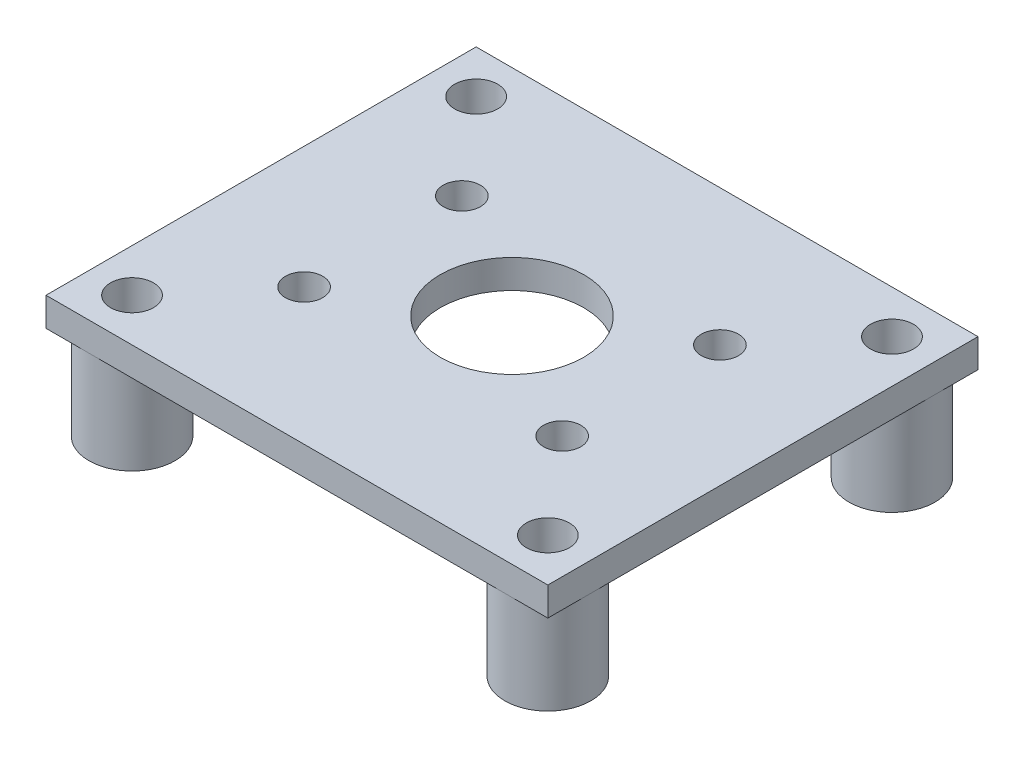
ISO-10303-21;
HEADER;
FILE_DESCRIPTION(('STEP AP214'),'2;1');
FILE_NAME('part.step','',(''),(''),'','','');
FILE_SCHEMA(('AUTOMOTIVE_DESIGN { 1 0 10303 214 1 1 1 1 }'));
ENDSEC;
DATA;
#1=APPLICATION_CONTEXT('core data for automotive mechanical design processes');
#2=APPLICATION_PROTOCOL_DEFINITION('international standard','automotive_design',2000,#1);
#3=PRODUCT_CONTEXT('',#1,'mechanical');
#4=PRODUCT('Part','Part','',(#3));
#5=PRODUCT_RELATED_PRODUCT_CATEGORY('part','',(#4));
#6=PRODUCT_DEFINITION_FORMATION('','',#4);
#7=PRODUCT_DEFINITION_CONTEXT('part definition',#1,'design');
#8=PRODUCT_DEFINITION('design','',#6,#7);
#9=PRODUCT_DEFINITION_SHAPE('','',#8);
#10=(LENGTH_UNIT() NAMED_UNIT(*) SI_UNIT(.MILLI.,.METRE.));
#11=(NAMED_UNIT(*) PLANE_ANGLE_UNIT() SI_UNIT($,.RADIAN.));
#12=(NAMED_UNIT(*) SI_UNIT($,.STERADIAN.) SOLID_ANGLE_UNIT());
#13=UNCERTAINTY_MEASURE_WITH_UNIT(LENGTH_MEASURE(1.E-05),#10,'distance_accuracy_value','');
#14=(GEOMETRIC_REPRESENTATION_CONTEXT(3) GLOBAL_UNCERTAINTY_ASSIGNED_CONTEXT((#13)) GLOBAL_UNIT_ASSIGNED_CONTEXT((#10,
#11,#12)) REPRESENTATION_CONTEXT('',''));
#15=CARTESIAN_POINT('',(0.,0.,0.));
#16=DIRECTION('',(0.,0.,1.));
#17=DIRECTION('',(1.,0.,0.));
#18=AXIS2_PLACEMENT_3D('',#15,#16,#17);
#19=CARTESIAN_POINT('',(0.,0.,0.));
#20=DIRECTION('',(0.,1.,0.));
#21=DIRECTION('',(0.,0.,1.));
#22=AXIS2_PLACEMENT_3D('',#19,#20,#21);
#23=PLANE('',#22);
#24=CARTESIAN_POINT('',(14.5,0.,-12.));
#25=DIRECTION('',(0.,-1.,0.));
#26=DIRECTION('',(0.,0.,-1.));
#27=AXIS2_PLACEMENT_3D('',#24,#25,#26);
#28=CIRCLE('',#27,3.);
#29=CARTESIAN_POINT('',(14.5,0.,-15.));
#30=VERTEX_POINT('',#29);
#31=CARTESIAN_POINT('',(17.5,0.,-12.));
#32=VERTEX_POINT('',#31);
#33=EDGE_CURVE('E118',#30,#32,#28,.T.);
#34=ORIENTED_EDGE('',*,*,#33,.F.);
#35=DIRECTION('',(-1.,0.,0.));
#36=VECTOR('',#35,1.);
#37=CARTESIAN_POINT('',(-17.5,0.,-15.));
#38=LINE('',#37,#36);
#39=CARTESIAN_POINT('',(17.5,0.,-15.));
#40=VERTEX_POINT('',#39);
#41=EDGE_CURVE('E103',#40,#30,#38,.T.);
#42=ORIENTED_EDGE('',*,*,#41,.F.);
#43=DIRECTION('',(0.,0.,-1.));
#44=VECTOR('',#43,1.);
#45=CARTESIAN_POINT('',(17.5,0.,-15.));
#46=LINE('',#45,#44);
#47=EDGE_CURVE('E119',#32,#40,#46,.T.);
#48=ORIENTED_EDGE('',*,*,#47,.F.);
#49=EDGE_LOOP('',(#34,#42,#48));
#50=FACE_BOUND('',#49,.T.);
#51=ADVANCED_FACE('F36',(#50),#23,.F.);
#52=CARTESIAN_POINT('',(-14.5,0.,-12.));
#53=DIRECTION('',(0.,-1.,0.));
#54=DIRECTION('',(0.,0.,-1.));
#55=AXIS2_PLACEMENT_3D('',#52,#53,#54);
#56=CIRCLE('',#55,3.);
#57=CARTESIAN_POINT('',(-17.5,0.,-12.));
#58=VERTEX_POINT('',#57);
#59=CARTESIAN_POINT('',(-14.5,0.,-15.));
#60=VERTEX_POINT('',#59);
#61=EDGE_CURVE('E136',#58,#60,#56,.T.);
#62=ORIENTED_EDGE('',*,*,#61,.F.);
#63=DIRECTION('',(0.,0.,1.));
#64=VECTOR('',#63,1.);
#65=CARTESIAN_POINT('',(-17.5,0.,-15.));
#66=LINE('',#65,#64);
#67=CARTESIAN_POINT('',(-17.5,0.,-15.));
#68=VERTEX_POINT('',#67);
#69=EDGE_CURVE('E198',#68,#58,#66,.T.);
#70=ORIENTED_EDGE('',*,*,#69,.F.);
#71=EDGE_CURVE('E110',#60,#68,#38,.T.);
#72=ORIENTED_EDGE('',*,*,#71,.F.);
#73=EDGE_LOOP('',(#62,#70,#72));
#74=FACE_BOUND('',#73,.T.);
#75=ADVANCED_FACE('F218',(#74),#23,.F.);
#76=CARTESIAN_POINT('',(0.,0.,0.));
#77=DIRECTION('',(0.,1.,0.));
#78=DIRECTION('',(0.,0.,1.));
#79=AXIS2_PLACEMENT_3D('',#76,#77,#78);
#80=CIRCLE('',#79,5.);
#81=CARTESIAN_POINT('',(0.,0.,5.));
#82=VERTEX_POINT('',#81);
#83=EDGE_CURVE('E517',#82,#82,#80,.T.);
#84=ORIENTED_EDGE('',*,*,#83,.T.);
#85=EDGE_LOOP('',(#84));
#86=FACE_BOUND('',#85,.T.);
#87=EDGE_CURVE('E53',#32,#30,#28,.T.);
#88=ORIENTED_EDGE('',*,*,#87,.F.);
#89=CARTESIAN_POINT('',(17.5,0.,12.));
#90=VERTEX_POINT('',#89);
#91=EDGE_CURVE('E196',#90,#32,#46,.T.);
#92=ORIENTED_EDGE('',*,*,#91,.F.);
#93=CARTESIAN_POINT('',(14.5,0.,12.));
#94=DIRECTION('',(0.,-1.,0.));
#95=DIRECTION('',(0.,0.,-1.));
#96=AXIS2_PLACEMENT_3D('',#93,#94,#95);
#97=CIRCLE('',#96,3.);
#98=CARTESIAN_POINT('',(14.5,0.,15.));
#99=VERTEX_POINT('',#98);
#100=EDGE_CURVE('E134',#99,#90,#97,.T.);
#101=ORIENTED_EDGE('',*,*,#100,.F.);
#102=DIRECTION('',(1.,0.,0.));
#103=VECTOR('',#102,1.);
#104=CARTESIAN_POINT('',(-17.5,0.,15.));
#105=LINE('',#104,#103);
#106=CARTESIAN_POINT('',(-14.5,0.,15.));
#107=VERTEX_POINT('',#106);
#108=EDGE_CURVE('E203',#107,#99,#105,.T.);
#109=ORIENTED_EDGE('',*,*,#108,.F.);
#110=CARTESIAN_POINT('',(-14.5,0.,12.));
#111=DIRECTION('',(0.,-1.,0.));
#112=DIRECTION('',(0.,0.,-1.));
#113=AXIS2_PLACEMENT_3D('',#110,#111,#112);
#114=CIRCLE('',#113,3.);
#115=CARTESIAN_POINT('',(-17.5,0.,12.));
#116=VERTEX_POINT('',#115);
#117=EDGE_CURVE('E11',#116,#107,#114,.T.);
#118=ORIENTED_EDGE('',*,*,#117,.F.);
#119=EDGE_CURVE('E201',#58,#116,#66,.T.);
#120=ORIENTED_EDGE('',*,*,#119,.F.);
#121=EDGE_CURVE('E115',#60,#58,#56,.T.);
#122=ORIENTED_EDGE('',*,*,#121,.F.);
#123=EDGE_CURVE('E60',#30,#60,#38,.T.);
#124=ORIENTED_EDGE('',*,*,#123,.F.);
#125=EDGE_LOOP('',(#88,#92,#101,#109,#118,#120,#122,#124));
#126=FACE_BOUND('',#125,.T.);
#127=CARTESIAN_POINT('',(-9.,0.,-5.5));
#128=DIRECTION('',(0.,1.,0.));
#129=DIRECTION('',(0.,0.,1.));
#130=AXIS2_PLACEMENT_3D('',#127,#128,#129);
#131=CIRCLE('',#130,1.3);
#132=CARTESIAN_POINT('',(-9.,0.,-4.2));
#133=VERTEX_POINT('',#132);
#134=EDGE_CURVE('E169',#133,#133,#131,.F.);
#135=ORIENTED_EDGE('',*,*,#134,.F.);
#136=EDGE_LOOP('',(#135));
#137=FACE_BOUND('',#136,.T.);
#138=CARTESIAN_POINT('',(9.,0.,5.5));
#139=DIRECTION('',(0.,1.,0.));
#140=DIRECTION('',(0.,0.,1.));
#141=AXIS2_PLACEMENT_3D('',#138,#139,#140);
#142=CIRCLE('',#141,1.3);
#143=CARTESIAN_POINT('',(9.,0.,6.8));
#144=VERTEX_POINT('',#143);
#145=EDGE_CURVE('E170',#144,#144,#142,.F.);
#146=ORIENTED_EDGE('',*,*,#145,.F.);
#147=EDGE_LOOP('',(#146));
#148=FACE_BOUND('',#147,.T.);
#149=CARTESIAN_POINT('',(-9.,0.,5.5));
#150=DIRECTION('',(0.,1.,0.));
#151=DIRECTION('',(0.,0.,1.));
#152=AXIS2_PLACEMENT_3D('',#149,#150,#151);
#153=CIRCLE('',#152,1.3);
#154=CARTESIAN_POINT('',(-9.,0.,6.8));
#155=VERTEX_POINT('',#154);
#156=EDGE_CURVE('E162',#155,#155,#153,.F.);
#157=ORIENTED_EDGE('',*,*,#156,.F.);
#158=EDGE_LOOP('',(#157));
#159=FACE_BOUND('',#158,.T.);
#160=CARTESIAN_POINT('',(9.,0.,-5.5));
#161=DIRECTION('',(0.,1.,0.));
#162=DIRECTION('',(0.,0.,1.));
#163=AXIS2_PLACEMENT_3D('',#160,#161,#162);
#164=CIRCLE('',#163,1.3);
#165=CARTESIAN_POINT('',(9.,0.,-4.2));
#166=VERTEX_POINT('',#165);
#167=EDGE_CURVE('E180',#166,#166,#164,.F.);
#168=ORIENTED_EDGE('',*,*,#167,.F.);
#169=EDGE_LOOP('',(#168));
#170=FACE_BOUND('',#169,.T.);
#171=ADVANCED_FACE('F111',(#86,#126,#137,#148,#159,#170),#23,.F.);
#172=EDGE_CURVE('E46',#107,#116,#114,.T.);
#173=ORIENTED_EDGE('',*,*,#172,.F.);
#174=CARTESIAN_POINT('',(-17.5,0.,15.));
#175=VERTEX_POINT('',#174);
#176=EDGE_CURVE('E187',#175,#107,#105,.T.);
#177=ORIENTED_EDGE('',*,*,#176,.F.);
#178=EDGE_CURVE('E108',#116,#175,#66,.T.);
#179=ORIENTED_EDGE('',*,*,#178,.F.);
#180=EDGE_LOOP('',(#173,#177,#179));
#181=FACE_BOUND('',#180,.T.);
#182=ADVANCED_FACE('F249',(#181),#23,.F.);
#183=CARTESIAN_POINT('',(17.5,2.,-15.));
#184=DIRECTION('',(-1.,0.,0.));
#185=DIRECTION('',(0.,0.,1.));
#186=AXIS2_PLACEMENT_3D('',#183,#184,#185);
#187=PLANE('',#186);
#188=CARTESIAN_POINT('',(17.5,0.,15.));
#189=VERTEX_POINT('',#188);
#190=EDGE_CURVE('E194',#189,#90,#46,.T.);
#191=ORIENTED_EDGE('',*,*,#190,.T.);
#192=ORIENTED_EDGE('',*,*,#91,.T.);
#193=ORIENTED_EDGE('',*,*,#47,.T.);
#194=DIRECTION('',(0.,-1.,0.));
#195=VECTOR('',#194,1.);
#196=CARTESIAN_POINT('',(17.5,2.,-15.));
#197=LINE('',#196,#195);
#198=CARTESIAN_POINT('',(17.5,2.,-15.));
#199=VERTEX_POINT('',#198);
#200=EDGE_CURVE('E40',#199,#40,#197,.T.);
#201=ORIENTED_EDGE('',*,*,#200,.F.);
#202=DIRECTION('',(0.,0.,-1.));
#203=VECTOR('',#202,1.);
#204=CARTESIAN_POINT('',(17.5,2.,-15.));
#205=LINE('',#204,#203);
#206=CARTESIAN_POINT('',(17.5,2.,15.));
#207=VERTEX_POINT('',#206);
#208=EDGE_CURVE('E183',#207,#199,#205,.T.);
#209=ORIENTED_EDGE('',*,*,#208,.F.);
#210=DIRECTION('',(0.,-1.,0.));
#211=VECTOR('',#210,1.);
#212=CARTESIAN_POINT('',(17.5,2.,15.));
#213=LINE('',#212,#211);
#214=EDGE_CURVE('E193',#207,#189,#213,.T.);
#215=ORIENTED_EDGE('',*,*,#214,.T.);
#216=EDGE_LOOP('',(#191,#192,#193,#201,#209,#215));
#217=FACE_BOUND('',#216,.T.);
#218=ADVANCED_FACE('F38',(#217),#187,.F.);
#219=CARTESIAN_POINT('',(-17.5,2.,-15.));
#220=DIRECTION('',(0.,0.,1.));
#221=DIRECTION('',(1.,0.,0.));
#222=AXIS2_PLACEMENT_3D('',#219,#220,#221);
#223=PLANE('',#222);
#224=ORIENTED_EDGE('',*,*,#41,.T.);
#225=ORIENTED_EDGE('',*,*,#123,.T.);
#226=ORIENTED_EDGE('',*,*,#71,.T.);
#227=DIRECTION('',(0.,-1.,0.));
#228=VECTOR('',#227,1.);
#229=CARTESIAN_POINT('',(-17.5,2.,-15.));
#230=LINE('',#229,#228);
#231=CARTESIAN_POINT('',(-17.5,2.,-15.));
#232=VERTEX_POINT('',#231);
#233=EDGE_CURVE('E208',#232,#68,#230,.T.);
#234=ORIENTED_EDGE('',*,*,#233,.F.);
#235=DIRECTION('',(-1.,0.,0.));
#236=VECTOR('',#235,1.);
#237=CARTESIAN_POINT('',(-17.5,2.,-15.));
#238=LINE('',#237,#236);
#239=EDGE_CURVE('E186',#199,#232,#238,.T.);
#240=ORIENTED_EDGE('',*,*,#239,.F.);
#241=ORIENTED_EDGE('',*,*,#200,.T.);
#242=EDGE_LOOP('',(#224,#225,#226,#234,#240,#241));
#243=FACE_BOUND('',#242,.T.);
#244=ADVANCED_FACE('F104',(#243),#223,.F.);
#245=CARTESIAN_POINT('',(-17.5,2.,-15.));
#246=DIRECTION('',(1.,0.,0.));
#247=DIRECTION('',(0.,0.,-1.));
#248=AXIS2_PLACEMENT_3D('',#245,#246,#247);
#249=PLANE('',#248);
#250=ORIENTED_EDGE('',*,*,#69,.T.);
#251=ORIENTED_EDGE('',*,*,#119,.T.);
#252=ORIENTED_EDGE('',*,*,#178,.T.);
#253=DIRECTION('',(0.,-1.,0.));
#254=VECTOR('',#253,1.);
#255=CARTESIAN_POINT('',(-17.5,2.,15.));
#256=LINE('',#255,#254);
#257=CARTESIAN_POINT('',(-17.5,2.,15.));
#258=VERTEX_POINT('',#257);
#259=EDGE_CURVE('E206',#258,#175,#256,.T.);
#260=ORIENTED_EDGE('',*,*,#259,.F.);
#261=DIRECTION('',(0.,0.,1.));
#262=VECTOR('',#261,1.);
#263=CARTESIAN_POINT('',(-17.5,2.,-15.));
#264=LINE('',#263,#262);
#265=EDGE_CURVE('E189',#232,#258,#264,.T.);
#266=ORIENTED_EDGE('',*,*,#265,.F.);
#267=ORIENTED_EDGE('',*,*,#233,.T.);
#268=EDGE_LOOP('',(#250,#251,#252,#260,#266,#267));
#269=FACE_BOUND('',#268,.T.);
#270=ADVANCED_FACE('F214',(#269),#249,.F.);
#271=CARTESIAN_POINT('',(-17.5,2.,15.));
#272=DIRECTION('',(0.,0.,-1.));
#273=DIRECTION('',(-1.,0.,0.));
#274=AXIS2_PLACEMENT_3D('',#271,#272,#273);
#275=PLANE('',#274);
#276=ORIENTED_EDGE('',*,*,#176,.T.);
#277=ORIENTED_EDGE('',*,*,#108,.T.);
#278=EDGE_CURVE('E200',#99,#189,#105,.T.);
#279=ORIENTED_EDGE('',*,*,#278,.T.);
#280=ORIENTED_EDGE('',*,*,#214,.F.);
#281=DIRECTION('',(1.,0.,0.));
#282=VECTOR('',#281,1.);
#283=CARTESIAN_POINT('',(-17.5,2.,15.));
#284=LINE('',#283,#282);
#285=EDGE_CURVE('E191',#258,#207,#284,.T.);
#286=ORIENTED_EDGE('',*,*,#285,.F.);
#287=ORIENTED_EDGE('',*,*,#259,.T.);
#288=EDGE_LOOP('',(#276,#277,#279,#280,#286,#287));
#289=FACE_BOUND('',#288,.T.);
#290=ADVANCED_FACE('F257',(#289),#275,.F.);
#291=CARTESIAN_POINT('',(0.,2.,0.));
#292=DIRECTION('',(0.,1.,0.));
#293=DIRECTION('',(0.,0.,1.));
#294=AXIS2_PLACEMENT_3D('',#291,#292,#293);
#295=PLANE('',#294);
#296=CARTESIAN_POINT('',(0.,2.,0.));
#297=DIRECTION('',(0.,1.,0.));
#298=DIRECTION('',(0.,0.,1.));
#299=AXIS2_PLACEMENT_3D('',#296,#297,#298);
#300=CIRCLE('',#299,5.);
#301=CARTESIAN_POINT('',(0.,2.,5.));
#302=VERTEX_POINT('',#301);
#303=EDGE_CURVE('E514',#302,#302,#300,.T.);
#304=ORIENTED_EDGE('',*,*,#303,.F.);
#305=EDGE_LOOP('',(#304));
#306=FACE_BOUND('',#305,.T.);
#307=CARTESIAN_POINT('',(-14.5,2.,-12.));
#308=DIRECTION('',(0.,1.,0.));
#309=DIRECTION('',(0.,0.,1.));
#310=AXIS2_PLACEMENT_3D('',#307,#308,#309);
#311=CIRCLE('',#310,1.5);
#312=CARTESIAN_POINT('',(-14.5,2.,-10.5));
#313=VERTEX_POINT('',#312);
#314=EDGE_CURVE('E145',#313,#313,#311,.F.);
#315=ORIENTED_EDGE('',*,*,#314,.T.);
#316=EDGE_LOOP('',(#315));
#317=FACE_BOUND('',#316,.T.);
#318=CARTESIAN_POINT('',(14.5,2.,-12.));
#319=DIRECTION('',(0.,1.,0.));
#320=DIRECTION('',(0.,0.,1.));
#321=AXIS2_PLACEMENT_3D('',#318,#319,#320);
#322=CIRCLE('',#321,1.5);
#323=CARTESIAN_POINT('',(14.5,2.,-10.5));
#324=VERTEX_POINT('',#323);
#325=EDGE_CURVE('E152',#324,#324,#322,.F.);
#326=ORIENTED_EDGE('',*,*,#325,.T.);
#327=EDGE_LOOP('',(#326));
#328=FACE_BOUND('',#327,.T.);
#329=CARTESIAN_POINT('',(14.5,2.,12.));
#330=DIRECTION('',(0.,1.,0.));
#331=DIRECTION('',(0.,0.,1.));
#332=AXIS2_PLACEMENT_3D('',#329,#330,#331);
#333=CIRCLE('',#332,1.5);
#334=CARTESIAN_POINT('',(14.5,2.,13.5));
#335=VERTEX_POINT('',#334);
#336=EDGE_CURVE('E148',#335,#335,#333,.F.);
#337=ORIENTED_EDGE('',*,*,#336,.T.);
#338=EDGE_LOOP('',(#337));
#339=FACE_BOUND('',#338,.T.);
#340=CARTESIAN_POINT('',(-14.5,2.,12.));
#341=DIRECTION('',(0.,1.,0.));
#342=DIRECTION('',(0.,0.,1.));
#343=AXIS2_PLACEMENT_3D('',#340,#341,#342);
#344=CIRCLE('',#343,1.5);
#345=CARTESIAN_POINT('',(-14.5,2.,13.5));
#346=VERTEX_POINT('',#345);
#347=EDGE_CURVE('E151',#346,#346,#344,.F.);
#348=ORIENTED_EDGE('',*,*,#347,.T.);
#349=EDGE_LOOP('',(#348));
#350=FACE_BOUND('',#349,.T.);
#351=CARTESIAN_POINT('',(-9.,2.,-5.5));
#352=DIRECTION('',(0.,1.,0.));
#353=DIRECTION('',(0.,0.,-1.));
#354=AXIS2_PLACEMENT_3D('',#351,#352,#353);
#355=CIRCLE('',#354,1.3);
#356=CARTESIAN_POINT('',(-9.,2.,-6.8));
#357=VERTEX_POINT('',#356);
#358=EDGE_CURVE('E166',#357,#357,#355,.T.);
#359=ORIENTED_EDGE('',*,*,#358,.F.);
#360=EDGE_LOOP('',(#359));
#361=FACE_BOUND('',#360,.T.);
#362=CARTESIAN_POINT('',(9.,2.,5.5));
#363=DIRECTION('',(0.,1.,0.));
#364=DIRECTION('',(0.,0.,-1.));
#365=AXIS2_PLACEMENT_3D('',#362,#363,#364);
#366=CIRCLE('',#365,1.3);
#367=CARTESIAN_POINT('',(9.,2.,4.2));
#368=VERTEX_POINT('',#367);
#369=EDGE_CURVE('E165',#368,#368,#366,.T.);
#370=ORIENTED_EDGE('',*,*,#369,.F.);
#371=EDGE_LOOP('',(#370));
#372=FACE_BOUND('',#371,.T.);
#373=CARTESIAN_POINT('',(-9.,2.,5.5));
#374=DIRECTION('',(0.,1.,0.));
#375=DIRECTION('',(0.,0.,1.));
#376=AXIS2_PLACEMENT_3D('',#373,#374,#375);
#377=CIRCLE('',#376,1.3);
#378=CARTESIAN_POINT('',(-9.,2.,6.8));
#379=VERTEX_POINT('',#378);
#380=EDGE_CURVE('E159',#379,#379,#377,.T.);
#381=ORIENTED_EDGE('',*,*,#380,.F.);
#382=EDGE_LOOP('',(#381));
#383=FACE_BOUND('',#382,.T.);
#384=CARTESIAN_POINT('',(9.,2.,-5.5));
#385=DIRECTION('',(0.,1.,0.));
#386=DIRECTION('',(0.,0.,1.));
#387=AXIS2_PLACEMENT_3D('',#384,#385,#386);
#388=CIRCLE('',#387,1.3);
#389=CARTESIAN_POINT('',(9.,2.,-4.2));
#390=VERTEX_POINT('',#389);
#391=EDGE_CURVE('E173',#390,#390,#388,.T.);
#392=ORIENTED_EDGE('',*,*,#391,.F.);
#393=EDGE_LOOP('',(#392));
#394=FACE_BOUND('',#393,.T.);
#395=ORIENTED_EDGE('',*,*,#208,.T.);
#396=ORIENTED_EDGE('',*,*,#239,.T.);
#397=ORIENTED_EDGE('',*,*,#265,.T.);
#398=ORIENTED_EDGE('',*,*,#285,.T.);
#399=EDGE_LOOP('',(#395,#396,#397,#398));
#400=FACE_BOUND('',#399,.T.);
#401=ADVANCED_FACE('F247',(#306,#317,#328,#339,#350,#361,#372,#383,#394,#400),#295,.T.);
#402=EDGE_CURVE('E140',#90,#99,#97,.T.);
#403=ORIENTED_EDGE('',*,*,#402,.F.);
#404=ORIENTED_EDGE('',*,*,#190,.F.);
#405=ORIENTED_EDGE('',*,*,#278,.F.);
#406=EDGE_LOOP('',(#403,#404,#405));
#407=FACE_BOUND('',#406,.T.);
#408=ADVANCED_FACE('F239',(#407),#23,.F.);
#409=CARTESIAN_POINT('',(9.,-0.00100000000000013,-5.5));
#410=DIRECTION('',(0.,1.,0.));
#411=DIRECTION('',(0.,0.,1.));
#412=AXIS2_PLACEMENT_3D('',#409,#410,#411);
#413=CYLINDRICAL_SURFACE('',#412,1.3);
#414=ORIENTED_EDGE('',*,*,#391,.T.);
#415=EDGE_LOOP('',(#414));
#416=FACE_BOUND('',#415,.T.);
#417=ORIENTED_EDGE('',*,*,#167,.T.);
#418=EDGE_LOOP('',(#417));
#419=FACE_BOUND('',#418,.T.);
#420=ADVANCED_FACE('F246',(#416,#419),#413,.F.);
#421=CARTESIAN_POINT('',(-9.,-0.00100000000000013,5.5));
#422=DIRECTION('',(0.,1.,0.));
#423=DIRECTION('',(0.,0.,1.));
#424=AXIS2_PLACEMENT_3D('',#421,#422,#423);
#425=CYLINDRICAL_SURFACE('',#424,1.3);
#426=ORIENTED_EDGE('',*,*,#380,.T.);
#427=EDGE_LOOP('',(#426));
#428=FACE_BOUND('',#427,.T.);
#429=ORIENTED_EDGE('',*,*,#156,.T.);
#430=EDGE_LOOP('',(#429));
#431=FACE_BOUND('',#430,.T.);
#432=ADVANCED_FACE('F254',(#428,#431),#425,.F.);
#433=CARTESIAN_POINT('',(9.,-0.00100000000000013,5.5));
#434=DIRECTION('',(0.,1.,0.));
#435=DIRECTION('',(0.,0.,1.));
#436=AXIS2_PLACEMENT_3D('',#433,#434,#435);
#437=CYLINDRICAL_SURFACE('',#436,1.3);
#438=ORIENTED_EDGE('',*,*,#369,.T.);
#439=EDGE_LOOP('',(#438));
#440=FACE_BOUND('',#439,.T.);
#441=ORIENTED_EDGE('',*,*,#145,.T.);
#442=EDGE_LOOP('',(#441));
#443=FACE_BOUND('',#442,.T.);
#444=ADVANCED_FACE('F316',(#440,#443),#437,.F.);
#445=CARTESIAN_POINT('',(-9.,-0.00100000000000013,-5.5));
#446=DIRECTION('',(0.,1.,0.));
#447=DIRECTION('',(0.,0.,1.));
#448=AXIS2_PLACEMENT_3D('',#445,#446,#447);
#449=CYLINDRICAL_SURFACE('',#448,1.3);
#450=ORIENTED_EDGE('',*,*,#358,.T.);
#451=EDGE_LOOP('',(#450));
#452=FACE_BOUND('',#451,.T.);
#453=ORIENTED_EDGE('',*,*,#134,.T.);
#454=EDGE_LOOP('',(#453));
#455=FACE_BOUND('',#454,.T.);
#456=ADVANCED_FACE('F312',(#452,#455),#449,.F.);
#457=CARTESIAN_POINT('',(-14.5,2.001,12.));
#458=DIRECTION('',(0.,-1.,0.));
#459=DIRECTION('',(0.,0.,-1.));
#460=AXIS2_PLACEMENT_3D('',#457,#458,#459);
#461=CYLINDRICAL_SURFACE('',#460,1.5);
#462=ORIENTED_EDGE('',*,*,#347,.F.);
#463=EDGE_LOOP('',(#462));
#464=FACE_BOUND('',#463,.T.);
#465=CARTESIAN_POINT('',(-14.5,-6.5,12.));
#466=DIRECTION('',(0.,-1.,0.));
#467=DIRECTION('',(0.,0.,-1.));
#468=AXIS2_PLACEMENT_3D('',#465,#466,#467);
#469=CIRCLE('',#468,1.5);
#470=CARTESIAN_POINT('',(-14.5,-6.5,10.5));
#471=VERTEX_POINT('',#470);
#472=EDGE_CURVE('E518',#471,#471,#469,.F.);
#473=ORIENTED_EDGE('',*,*,#472,.F.);
#474=EDGE_LOOP('',(#473));
#475=FACE_BOUND('',#474,.T.);
#476=ADVANCED_FACE('F302',(#464,#475),#461,.F.);
#477=CARTESIAN_POINT('',(14.5,2.001,12.));
#478=DIRECTION('',(0.,-1.,0.));
#479=DIRECTION('',(0.,0.,-1.));
#480=AXIS2_PLACEMENT_3D('',#477,#478,#479);
#481=CYLINDRICAL_SURFACE('',#480,1.5);
#482=ORIENTED_EDGE('',*,*,#336,.F.);
#483=EDGE_LOOP('',(#482));
#484=FACE_BOUND('',#483,.T.);
#485=CARTESIAN_POINT('',(14.5,-6.5,12.));
#486=DIRECTION('',(0.,-1.,0.));
#487=DIRECTION('',(0.,0.,-1.));
#488=AXIS2_PLACEMENT_3D('',#485,#486,#487);
#489=CIRCLE('',#488,1.5);
#490=CARTESIAN_POINT('',(14.5,-6.5,10.5));
#491=VERTEX_POINT('',#490);
#492=EDGE_CURVE('E521',#491,#491,#489,.F.);
#493=ORIENTED_EDGE('',*,*,#492,.F.);
#494=EDGE_LOOP('',(#493));
#495=FACE_BOUND('',#494,.T.);
#496=ADVANCED_FACE('F298',(#484,#495),#481,.F.);
#497=CARTESIAN_POINT('',(14.5,2.001,-12.));
#498=DIRECTION('',(0.,-1.,0.));
#499=DIRECTION('',(0.,0.,-1.));
#500=AXIS2_PLACEMENT_3D('',#497,#498,#499);
#501=CYLINDRICAL_SURFACE('',#500,1.5);
#502=ORIENTED_EDGE('',*,*,#325,.F.);
#503=EDGE_LOOP('',(#502));
#504=FACE_BOUND('',#503,.T.);
#505=CARTESIAN_POINT('',(14.5,-6.5,-12.));
#506=DIRECTION('',(0.,-1.,0.));
#507=DIRECTION('',(0.,0.,-1.));
#508=AXIS2_PLACEMENT_3D('',#505,#506,#507);
#509=CIRCLE('',#508,1.5);
#510=CARTESIAN_POINT('',(14.5,-6.5,-13.5));
#511=VERTEX_POINT('',#510);
#512=EDGE_CURVE('E127',#511,#511,#509,.F.);
#513=ORIENTED_EDGE('',*,*,#512,.F.);
#514=EDGE_LOOP('',(#513));
#515=FACE_BOUND('',#514,.T.);
#516=ADVANCED_FACE('F301',(#504,#515),#501,.F.);
#517=CARTESIAN_POINT('',(-14.5,2.001,-12.));
#518=DIRECTION('',(0.,-1.,0.));
#519=DIRECTION('',(0.,0.,-1.));
#520=AXIS2_PLACEMENT_3D('',#517,#518,#519);
#521=CYLINDRICAL_SURFACE('',#520,1.5);
#522=ORIENTED_EDGE('',*,*,#314,.F.);
#523=EDGE_LOOP('',(#522));
#524=FACE_BOUND('',#523,.T.);
#525=CARTESIAN_POINT('',(-14.5,-6.5,-12.));
#526=DIRECTION('',(0.,-1.,0.));
#527=DIRECTION('',(0.,0.,-1.));
#528=AXIS2_PLACEMENT_3D('',#525,#526,#527);
#529=CIRCLE('',#528,1.5);
#530=CARTESIAN_POINT('',(-14.5,-6.5,-13.5));
#531=VERTEX_POINT('',#530);
#532=EDGE_CURVE('E125',#531,#531,#529,.F.);
#533=ORIENTED_EDGE('',*,*,#532,.F.);
#534=EDGE_LOOP('',(#533));
#535=FACE_BOUND('',#534,.T.);
#536=ADVANCED_FACE('F295',(#524,#535),#521,.F.);
#537=CARTESIAN_POINT('',(-14.5,-6.5,12.));
#538=DIRECTION('',(0.,-1.,0.));
#539=DIRECTION('',(0.,0.,-1.));
#540=AXIS2_PLACEMENT_3D('',#537,#538,#539);
#541=PLANE('',#540);
#542=ORIENTED_EDGE('',*,*,#472,.T.);
#543=EDGE_LOOP('',(#542));
#544=FACE_BOUND('',#543,.T.);
#545=CARTESIAN_POINT('',(-14.5,-6.5,12.));
#546=DIRECTION('',(0.,-1.,0.));
#547=DIRECTION('',(0.,0.,-1.));
#548=AXIS2_PLACEMENT_3D('',#545,#546,#547);
#549=CIRCLE('',#548,3.);
#550=CARTESIAN_POINT('',(-14.5,-6.5,8.99999999999999));
#551=VERTEX_POINT('',#550);
#552=EDGE_CURVE('E143',#551,#551,#549,.T.);
#553=ORIENTED_EDGE('',*,*,#552,.T.);
#554=EDGE_LOOP('',(#553));
#555=FACE_BOUND('',#554,.T.);
#556=ADVANCED_FACE('F289',(#544,#555),#541,.T.);
#557=CARTESIAN_POINT('',(-14.5,-6.5,12.));
#558=DIRECTION('',(0.,1.,0.));
#559=DIRECTION('',(0.,0.,1.));
#560=AXIS2_PLACEMENT_3D('',#557,#558,#559);
#561=CYLINDRICAL_SURFACE('',#560,3.);
#562=ORIENTED_EDGE('',*,*,#552,.F.);
#563=EDGE_LOOP('',(#562));
#564=FACE_BOUND('',#563,.T.);
#565=ORIENTED_EDGE('',*,*,#172,.T.);
#566=ORIENTED_EDGE('',*,*,#117,.T.);
#567=EDGE_LOOP('',(#565,#566));
#568=FACE_BOUND('',#567,.T.);
#569=ADVANCED_FACE('F272',(#564,#568),#561,.T.);
#570=CARTESIAN_POINT('',(14.5,-6.5,12.));
#571=DIRECTION('',(0.,1.,0.));
#572=DIRECTION('',(0.,0.,1.));
#573=AXIS2_PLACEMENT_3D('',#570,#571,#572);
#574=CYLINDRICAL_SURFACE('',#573,3.);
#575=CARTESIAN_POINT('',(14.5,-6.5,12.));
#576=DIRECTION('',(0.,-1.,0.));
#577=DIRECTION('',(0.,0.,-1.));
#578=AXIS2_PLACEMENT_3D('',#575,#576,#577);
#579=CIRCLE('',#578,3.);
#580=CARTESIAN_POINT('',(14.5,-6.5,8.99999999999999));
#581=VERTEX_POINT('',#580);
#582=EDGE_CURVE('E137',#581,#581,#579,.T.);
#583=ORIENTED_EDGE('',*,*,#582,.F.);
#584=EDGE_LOOP('',(#583));
#585=FACE_BOUND('',#584,.T.);
#586=ORIENTED_EDGE('',*,*,#402,.T.);
#587=ORIENTED_EDGE('',*,*,#100,.T.);
#588=EDGE_LOOP('',(#586,#587));
#589=FACE_BOUND('',#588,.T.);
#590=ADVANCED_FACE('F233',(#585,#589),#574,.T.);
#591=CARTESIAN_POINT('',(14.5,-6.5,12.));
#592=DIRECTION('',(0.,-1.,0.));
#593=DIRECTION('',(0.,0.,-1.));
#594=AXIS2_PLACEMENT_3D('',#591,#592,#593);
#595=PLANE('',#594);
#596=ORIENTED_EDGE('',*,*,#492,.T.);
#597=EDGE_LOOP('',(#596));
#598=FACE_BOUND('',#597,.T.);
#599=ORIENTED_EDGE('',*,*,#582,.T.);
#600=EDGE_LOOP('',(#599));
#601=FACE_BOUND('',#600,.T.);
#602=ADVANCED_FACE('F224',(#598,#601),#595,.T.);
#603=CARTESIAN_POINT('',(-14.5,-6.5,-12.));
#604=DIRECTION('',(0.,1.,0.));
#605=DIRECTION('',(0.,0.,1.));
#606=AXIS2_PLACEMENT_3D('',#603,#604,#605);
#607=CYLINDRICAL_SURFACE('',#606,3.);
#608=CARTESIAN_POINT('',(-14.5,-6.5,-12.));
#609=DIRECTION('',(0.,-1.,0.));
#610=DIRECTION('',(0.,0.,-1.));
#611=AXIS2_PLACEMENT_3D('',#608,#609,#610);
#612=CIRCLE('',#611,3.);
#613=CARTESIAN_POINT('',(-14.5,-6.5,-15.));
#614=VERTEX_POINT('',#613);
#615=EDGE_CURVE('E131',#614,#614,#612,.T.);
#616=ORIENTED_EDGE('',*,*,#615,.F.);
#617=EDGE_LOOP('',(#616));
#618=FACE_BOUND('',#617,.T.);
#619=ORIENTED_EDGE('',*,*,#121,.T.);
#620=ORIENTED_EDGE('',*,*,#61,.T.);
#621=EDGE_LOOP('',(#619,#620));
#622=FACE_BOUND('',#621,.T.);
#623=ADVANCED_FACE('F221',(#618,#622),#607,.T.);
#624=CARTESIAN_POINT('',(-14.5,-6.5,-12.));
#625=DIRECTION('',(0.,-1.,0.));
#626=DIRECTION('',(0.,0.,-1.));
#627=AXIS2_PLACEMENT_3D('',#624,#625,#626);
#628=PLANE('',#627);
#629=ORIENTED_EDGE('',*,*,#532,.T.);
#630=EDGE_LOOP('',(#629));
#631=FACE_BOUND('',#630,.T.);
#632=ORIENTED_EDGE('',*,*,#615,.T.);
#633=EDGE_LOOP('',(#632));
#634=FACE_BOUND('',#633,.T.);
#635=ADVANCED_FACE('F223',(#631,#634),#628,.T.);
#636=CARTESIAN_POINT('',(14.5,-6.5,-12.));
#637=DIRECTION('',(0.,1.,0.));
#638=DIRECTION('',(0.,0.,1.));
#639=AXIS2_PLACEMENT_3D('',#636,#637,#638);
#640=CYLINDRICAL_SURFACE('',#639,3.);
#641=CARTESIAN_POINT('',(14.5,-6.5,-12.));
#642=DIRECTION('',(0.,-1.,0.));
#643=DIRECTION('',(0.,0.,-1.));
#644=AXIS2_PLACEMENT_3D('',#641,#642,#643);
#645=CIRCLE('',#644,3.);
#646=CARTESIAN_POINT('',(14.5,-6.5,-15.));
#647=VERTEX_POINT('',#646);
#648=EDGE_CURVE('E122',#647,#647,#645,.T.);
#649=ORIENTED_EDGE('',*,*,#648,.F.);
#650=EDGE_LOOP('',(#649));
#651=FACE_BOUND('',#650,.T.);
#652=ORIENTED_EDGE('',*,*,#33,.T.);
#653=ORIENTED_EDGE('',*,*,#87,.T.);
#654=EDGE_LOOP('',(#652,#653));
#655=FACE_BOUND('',#654,.T.);
#656=ADVANCED_FACE('F124',(#651,#655),#640,.T.);
#657=CARTESIAN_POINT('',(14.5,-6.5,-12.));
#658=DIRECTION('',(0.,-1.,0.));
#659=DIRECTION('',(0.,0.,-1.));
#660=AXIS2_PLACEMENT_3D('',#657,#658,#659);
#661=PLANE('',#660);
#662=ORIENTED_EDGE('',*,*,#512,.T.);
#663=EDGE_LOOP('',(#662));
#664=FACE_BOUND('',#663,.T.);
#665=ORIENTED_EDGE('',*,*,#648,.T.);
#666=EDGE_LOOP('',(#665));
#667=FACE_BOUND('',#666,.T.);
#668=ADVANCED_FACE('F393',(#664,#667),#661,.T.);
#669=CARTESIAN_POINT('',(0.,-1.,0.));
#670=DIRECTION('',(0.,1.,0.));
#671=DIRECTION('',(0.,0.,1.));
#672=AXIS2_PLACEMENT_3D('',#669,#670,#671);
#673=CYLINDRICAL_SURFACE('',#672,5.);
#674=ORIENTED_EDGE('',*,*,#303,.T.);
#675=EDGE_LOOP('',(#674));
#676=FACE_BOUND('',#675,.T.);
#677=ORIENTED_EDGE('',*,*,#83,.F.);
#678=EDGE_LOOP('',(#677));
#679=FACE_BOUND('',#678,.T.);
#680=ADVANCED_FACE('F406',(#676,#679),#673,.F.);
#681=CLOSED_SHELL('',(#51,#75,#171,#182,#218,#244,#270,#290,#401,#408,#420,#432,#444,#456,#476,
#496,#516,#536,#556,#569,#590,#602,#623,#635,#656,#668,#680));
#682=MANIFOLD_SOLID_BREP('B2',#681);
#683=ADVANCED_BREP_SHAPE_REPRESENTATION('',(#18,#682),#14);
#684=SHAPE_DEFINITION_REPRESENTATION(#9,#683);
ENDSEC;
END-ISO-10303-21;
